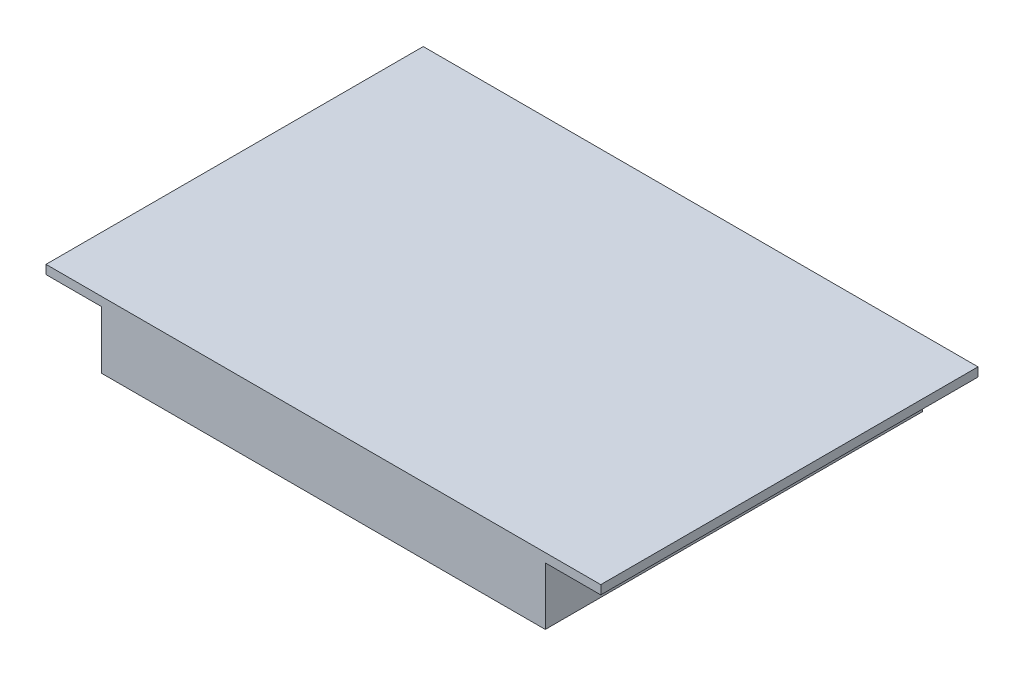
ISO-10303-21;
HEADER;
FILE_DESCRIPTION(('STEP AP214'),'2;1');
FILE_NAME('part.step','',(''),(''),'','','');
FILE_SCHEMA(('AUTOMOTIVE_DESIGN { 1 0 10303 214 1 1 1 1 }'));
ENDSEC;
DATA;
#1=APPLICATION_CONTEXT('core data for automotive mechanical design processes');
#2=APPLICATION_PROTOCOL_DEFINITION('international standard','automotive_design',2000,#1);
#3=PRODUCT_CONTEXT('',#1,'mechanical');
#4=PRODUCT('Part','Part','',(#3));
#5=PRODUCT_RELATED_PRODUCT_CATEGORY('part','',(#4));
#6=PRODUCT_DEFINITION_FORMATION('','',#4);
#7=PRODUCT_DEFINITION_CONTEXT('part definition',#1,'design');
#8=PRODUCT_DEFINITION('design','',#6,#7);
#9=PRODUCT_DEFINITION_SHAPE('','',#8);
#10=(LENGTH_UNIT() NAMED_UNIT(*) SI_UNIT(.MILLI.,.METRE.));
#11=(NAMED_UNIT(*) PLANE_ANGLE_UNIT() SI_UNIT($,.RADIAN.));
#12=(NAMED_UNIT(*) SI_UNIT($,.STERADIAN.) SOLID_ANGLE_UNIT());
#13=UNCERTAINTY_MEASURE_WITH_UNIT(LENGTH_MEASURE(1.E-05),#10,'distance_accuracy_value','');
#14=(GEOMETRIC_REPRESENTATION_CONTEXT(3) GLOBAL_UNCERTAINTY_ASSIGNED_CONTEXT((#13)) GLOBAL_UNIT_ASSIGNED_CONTEXT((#10,
#11,#12)) REPRESENTATION_CONTEXT('',''));
#15=CARTESIAN_POINT('',(0.,0.,0.));
#16=DIRECTION('',(0.,0.,1.));
#17=DIRECTION('',(1.,0.,0.));
#18=AXIS2_PLACEMENT_3D('',#15,#16,#17);
#19=CARTESIAN_POINT('',(0.,-15.,85.));
#20=DIRECTION('',(0.,1.,0.));
#21=DIRECTION('',(0.,0.,1.));
#22=AXIS2_PLACEMENT_3D('',#19,#20,#21);
#23=PLANE('',#22);
#24=DIRECTION('',(1.,0.,0.));
#25=VECTOR('',#24,1.);
#26=CARTESIAN_POINT('',(0.,-15.,-85.));
#27=LINE('',#26,#25);
#28=CARTESIAN_POINT('',(-100.,-15.,-85.));
#29=VERTEX_POINT('',#28);
#30=CARTESIAN_POINT('',(100.,-15.,-85.));
#31=VERTEX_POINT('',#30);
#32=EDGE_CURVE('E132',#29,#31,#27,.T.);
#33=ORIENTED_EDGE('',*,*,#32,.T.);
#34=DIRECTION('',(0.,0.,-1.));
#35=VECTOR('',#34,1.);
#36=CARTESIAN_POINT('',(100.,-15.,85.));
#37=LINE('',#36,#35);
#38=CARTESIAN_POINT('',(100.,-15.,85.));
#39=VERTEX_POINT('',#38);
#40=EDGE_CURVE('E11',#39,#31,#37,.T.);
#41=ORIENTED_EDGE('',*,*,#40,.F.);
#42=DIRECTION('',(1.,0.,0.));
#43=VECTOR('',#42,1.);
#44=CARTESIAN_POINT('',(0.,-15.,85.));
#45=LINE('',#44,#43);
#46=CARTESIAN_POINT('',(-100.,-15.,85.));
#47=VERTEX_POINT('',#46);
#48=EDGE_CURVE('E151',#47,#39,#45,.T.);
#49=ORIENTED_EDGE('',*,*,#48,.F.);
#50=DIRECTION('',(0.,0.,-1.));
#51=VECTOR('',#50,1.);
#52=CARTESIAN_POINT('',(-100.,-15.,85.));
#53=LINE('',#52,#51);
#54=EDGE_CURVE('E51',#47,#29,#53,.T.);
#55=ORIENTED_EDGE('',*,*,#54,.T.);
#56=EDGE_LOOP('',(#33,#41,#49,#55));
#57=FACE_BOUND('',#56,.T.);
#58=ADVANCED_FACE('F35',(#57),#23,.F.);
#59=CARTESIAN_POINT('',(100.,0.,85.));
#60=DIRECTION('',(-1.,0.,0.));
#61=DIRECTION('',(0.,0.,1.));
#62=AXIS2_PLACEMENT_3D('',#59,#60,#61);
#63=PLANE('',#62);
#64=DIRECTION('',(0.,1.,0.));
#65=VECTOR('',#64,1.);
#66=CARTESIAN_POINT('',(100.,0.,-85.));
#67=LINE('',#66,#65);
#68=CARTESIAN_POINT('',(100.,11.,-85.));
#69=VERTEX_POINT('',#68);
#70=EDGE_CURVE('E134',#31,#69,#67,.T.);
#71=ORIENTED_EDGE('',*,*,#70,.T.);
#72=DIRECTION('',(0.,0.,-1.));
#73=VECTOR('',#72,1.);
#74=CARTESIAN_POINT('',(100.,11.,85.));
#75=LINE('',#74,#73);
#76=CARTESIAN_POINT('',(100.,11.,85.));
#77=VERTEX_POINT('',#76);
#78=EDGE_CURVE('E43',#77,#69,#75,.T.);
#79=ORIENTED_EDGE('',*,*,#78,.F.);
#80=DIRECTION('',(0.,1.,0.));
#81=VECTOR('',#80,1.);
#82=CARTESIAN_POINT('',(100.,0.,85.));
#83=LINE('',#82,#81);
#84=EDGE_CURVE('E89',#39,#77,#83,.T.);
#85=ORIENTED_EDGE('',*,*,#84,.F.);
#86=ORIENTED_EDGE('',*,*,#40,.T.);
#87=EDGE_LOOP('',(#71,#79,#85,#86));
#88=FACE_BOUND('',#87,.T.);
#89=ADVANCED_FACE('F178',(#88),#63,.F.);
#90=CARTESIAN_POINT('',(0.,11.,85.));
#91=DIRECTION('',(0.,1.,0.));
#92=DIRECTION('',(-1.,0.,0.));
#93=AXIS2_PLACEMENT_3D('',#90,#91,#92);
#94=PLANE('',#93);
#95=DIRECTION('',(1.,0.,0.));
#96=VECTOR('',#95,1.);
#97=CARTESIAN_POINT('',(0.,11.,-85.));
#98=LINE('',#97,#96);
#99=CARTESIAN_POINT('',(125.,11.,-85.));
#100=VERTEX_POINT('',#99);
#101=EDGE_CURVE('E136',#69,#100,#98,.T.);
#102=ORIENTED_EDGE('',*,*,#101,.T.);
#103=DIRECTION('',(0.,0.,-1.));
#104=VECTOR('',#103,1.);
#105=CARTESIAN_POINT('',(125.,11.,85.));
#106=LINE('',#105,#104);
#107=CARTESIAN_POINT('',(125.,11.,85.));
#108=VERTEX_POINT('',#107);
#109=EDGE_CURVE('E157',#108,#100,#106,.T.);
#110=ORIENTED_EDGE('',*,*,#109,.F.);
#111=DIRECTION('',(1.,0.,0.));
#112=VECTOR('',#111,1.);
#113=CARTESIAN_POINT('',(0.,11.,85.));
#114=LINE('',#113,#112);
#115=EDGE_CURVE('E164',#77,#108,#114,.T.);
#116=ORIENTED_EDGE('',*,*,#115,.F.);
#117=ORIENTED_EDGE('',*,*,#78,.T.);
#118=EDGE_LOOP('',(#102,#110,#116,#117));
#119=FACE_BOUND('',#118,.T.);
#120=ADVANCED_FACE('F162',(#119),#94,.F.);
#121=CARTESIAN_POINT('',(125.,0.,85.));
#122=DIRECTION('',(1.,0.,0.));
#123=DIRECTION('',(0.,0.,-1.));
#124=AXIS2_PLACEMENT_3D('',#121,#122,#123);
#125=PLANE('',#124);
#126=DIRECTION('',(0.,-1.,0.));
#127=VECTOR('',#126,1.);
#128=CARTESIAN_POINT('',(125.,0.,-85.));
#129=LINE('',#128,#127);
#130=CARTESIAN_POINT('',(125.,15.,-85.));
#131=VERTEX_POINT('',#130);
#132=EDGE_CURVE('E139',#131,#100,#129,.T.);
#133=ORIENTED_EDGE('',*,*,#132,.F.);
#134=DIRECTION('',(0.,0.,-1.));
#135=VECTOR('',#134,1.);
#136=CARTESIAN_POINT('',(125.,15.,85.));
#137=LINE('',#136,#135);
#138=CARTESIAN_POINT('',(125.,15.,85.));
#139=VERTEX_POINT('',#138);
#140=EDGE_CURVE('E155',#139,#131,#137,.T.);
#141=ORIENTED_EDGE('',*,*,#140,.F.);
#142=DIRECTION('',(0.,-1.,0.));
#143=VECTOR('',#142,1.);
#144=CARTESIAN_POINT('',(125.,0.,85.));
#145=LINE('',#144,#143);
#146=EDGE_CURVE('E172',#139,#108,#145,.T.);
#147=ORIENTED_EDGE('',*,*,#146,.T.);
#148=ORIENTED_EDGE('',*,*,#109,.T.);
#149=EDGE_LOOP('',(#133,#141,#147,#148));
#150=FACE_BOUND('',#149,.T.);
#151=ADVANCED_FACE('F170',(#150),#125,.T.);
#152=CARTESIAN_POINT('',(0.,15.,85.));
#153=DIRECTION('',(0.,1.,0.));
#154=DIRECTION('',(0.,0.,1.));
#155=AXIS2_PLACEMENT_3D('',#152,#153,#154);
#156=PLANE('',#155);
#157=DIRECTION('',(1.,0.,0.));
#158=VECTOR('',#157,1.);
#159=CARTESIAN_POINT('',(0.,15.,-85.));
#160=LINE('',#159,#158);
#161=CARTESIAN_POINT('',(-125.,15.,-85.));
#162=VERTEX_POINT('',#161);
#163=EDGE_CURVE('E142',#162,#131,#160,.T.);
#164=ORIENTED_EDGE('',*,*,#163,.F.);
#165=DIRECTION('',(0.,0.,-1.));
#166=VECTOR('',#165,1.);
#167=CARTESIAN_POINT('',(-125.,15.,85.));
#168=LINE('',#167,#166);
#169=CARTESIAN_POINT('',(-125.,15.,85.));
#170=VERTEX_POINT('',#169);
#171=EDGE_CURVE('E124',#170,#162,#168,.T.);
#172=ORIENTED_EDGE('',*,*,#171,.F.);
#173=DIRECTION('',(1.,0.,0.));
#174=VECTOR('',#173,1.);
#175=CARTESIAN_POINT('',(0.,15.,85.));
#176=LINE('',#175,#174);
#177=EDGE_CURVE('E114',#170,#139,#176,.T.);
#178=ORIENTED_EDGE('',*,*,#177,.T.);
#179=ORIENTED_EDGE('',*,*,#140,.T.);
#180=EDGE_LOOP('',(#164,#172,#178,#179));
#181=FACE_BOUND('',#180,.T.);
#182=ADVANCED_FACE('F188',(#181),#156,.T.);
#183=CARTESIAN_POINT('',(-125.,0.,85.));
#184=DIRECTION('',(1.,0.,0.));
#185=DIRECTION('',(0.,0.,-1.));
#186=AXIS2_PLACEMENT_3D('',#183,#184,#185);
#187=PLANE('',#186);
#188=DIRECTION('',(0.,-1.,0.));
#189=VECTOR('',#188,1.);
#190=CARTESIAN_POINT('',(-125.,0.,-85.));
#191=LINE('',#190,#189);
#192=CARTESIAN_POINT('',(-125.,11.,-85.));
#193=VERTEX_POINT('',#192);
#194=EDGE_CURVE('E121',#162,#193,#191,.T.);
#195=ORIENTED_EDGE('',*,*,#194,.T.);
#196=DIRECTION('',(0.,0.,-1.));
#197=VECTOR('',#196,1.);
#198=CARTESIAN_POINT('',(-125.,11.,85.));
#199=LINE('',#198,#197);
#200=CARTESIAN_POINT('',(-125.,11.,85.));
#201=VERTEX_POINT('',#200);
#202=EDGE_CURVE('E118',#201,#193,#199,.T.);
#203=ORIENTED_EDGE('',*,*,#202,.F.);
#204=DIRECTION('',(0.,-1.,0.));
#205=VECTOR('',#204,1.);
#206=CARTESIAN_POINT('',(-125.,0.,85.));
#207=LINE('',#206,#205);
#208=EDGE_CURVE('E106',#170,#201,#207,.T.);
#209=ORIENTED_EDGE('',*,*,#208,.F.);
#210=ORIENTED_EDGE('',*,*,#171,.T.);
#211=EDGE_LOOP('',(#195,#203,#209,#210));
#212=FACE_BOUND('',#211,.T.);
#213=ADVANCED_FACE('F119',(#212),#187,.F.);
#214=CARTESIAN_POINT('',(0.,11.,85.));
#215=DIRECTION('',(0.,-1.,0.));
#216=DIRECTION('',(1.,0.,0.));
#217=AXIS2_PLACEMENT_3D('',#214,#215,#216);
#218=PLANE('',#217);
#219=DIRECTION('',(-1.,0.,0.));
#220=VECTOR('',#219,1.);
#221=CARTESIAN_POINT('',(0.,11.,-85.));
#222=LINE('',#221,#220);
#223=CARTESIAN_POINT('',(-100.,11.,-85.));
#224=VERTEX_POINT('',#223);
#225=EDGE_CURVE('E146',#224,#193,#222,.T.);
#226=ORIENTED_EDGE('',*,*,#225,.F.);
#227=DIRECTION('',(0.,0.,-1.));
#228=VECTOR('',#227,1.);
#229=CARTESIAN_POINT('',(-100.,11.,85.));
#230=LINE('',#229,#228);
#231=CARTESIAN_POINT('',(-100.,11.,85.));
#232=VERTEX_POINT('',#231);
#233=EDGE_CURVE('E77',#232,#224,#230,.T.);
#234=ORIENTED_EDGE('',*,*,#233,.F.);
#235=DIRECTION('',(-1.,0.,0.));
#236=VECTOR('',#235,1.);
#237=CARTESIAN_POINT('',(0.,11.,85.));
#238=LINE('',#237,#236);
#239=EDGE_CURVE('E111',#232,#201,#238,.T.);
#240=ORIENTED_EDGE('',*,*,#239,.T.);
#241=ORIENTED_EDGE('',*,*,#202,.T.);
#242=EDGE_LOOP('',(#226,#234,#240,#241));
#243=FACE_BOUND('',#242,.T.);
#244=ADVANCED_FACE('F126',(#243),#218,.T.);
#245=CARTESIAN_POINT('',(-100.,0.,85.));
#246=DIRECTION('',(-1.,0.,0.));
#247=DIRECTION('',(0.,0.,1.));
#248=AXIS2_PLACEMENT_3D('',#245,#246,#247);
#249=PLANE('',#248);
#250=DIRECTION('',(0.,1.,0.));
#251=VECTOR('',#250,1.);
#252=CARTESIAN_POINT('',(-100.,0.,-85.));
#253=LINE('',#252,#251);
#254=EDGE_CURVE('E148',#29,#224,#253,.T.);
#255=ORIENTED_EDGE('',*,*,#254,.F.);
#256=ORIENTED_EDGE('',*,*,#54,.F.);
#257=DIRECTION('',(0.,1.,0.));
#258=VECTOR('',#257,1.);
#259=CARTESIAN_POINT('',(-100.,0.,85.));
#260=LINE('',#259,#258);
#261=EDGE_CURVE('E127',#47,#232,#260,.T.);
#262=ORIENTED_EDGE('',*,*,#261,.T.);
#263=ORIENTED_EDGE('',*,*,#233,.T.);
#264=EDGE_LOOP('',(#255,#256,#262,#263));
#265=FACE_BOUND('',#264,.T.);
#266=ADVANCED_FACE('F196',(#265),#249,.T.);
#267=CARTESIAN_POINT('',(0.,0.,85.));
#268=DIRECTION('',(0.,0.,1.));
#269=DIRECTION('',(1.,0.,0.));
#270=AXIS2_PLACEMENT_3D('',#267,#268,#269);
#271=PLANE('',#270);
#272=ORIENTED_EDGE('',*,*,#48,.T.);
#273=ORIENTED_EDGE('',*,*,#84,.T.);
#274=ORIENTED_EDGE('',*,*,#115,.T.);
#275=ORIENTED_EDGE('',*,*,#146,.F.);
#276=ORIENTED_EDGE('',*,*,#177,.F.);
#277=ORIENTED_EDGE('',*,*,#208,.T.);
#278=ORIENTED_EDGE('',*,*,#239,.F.);
#279=ORIENTED_EDGE('',*,*,#261,.F.);
#280=EDGE_LOOP('',(#272,#273,#274,#275,#276,#277,#278,#279));
#281=FACE_BOUND('',#280,.T.);
#282=ADVANCED_FACE('F108',(#281),#271,.T.);
#283=CARTESIAN_POINT('',(0.,0.,-85.));
#284=DIRECTION('',(0.,0.,1.));
#285=DIRECTION('',(1.,0.,0.));
#286=AXIS2_PLACEMENT_3D('',#283,#284,#285);
#287=PLANE('',#286);
#288=ORIENTED_EDGE('',*,*,#32,.F.);
#289=ORIENTED_EDGE('',*,*,#254,.T.);
#290=ORIENTED_EDGE('',*,*,#225,.T.);
#291=ORIENTED_EDGE('',*,*,#194,.F.);
#292=ORIENTED_EDGE('',*,*,#163,.T.);
#293=ORIENTED_EDGE('',*,*,#132,.T.);
#294=ORIENTED_EDGE('',*,*,#101,.F.);
#295=ORIENTED_EDGE('',*,*,#70,.F.);
#296=EDGE_LOOP('',(#288,#289,#290,#291,#292,#293,#294,#295));
#297=FACE_BOUND('',#296,.T.);
#298=ADVANCED_FACE('F166',(#297),#287,.F.);
#299=CLOSED_SHELL('',(#58,#89,#120,#151,#182,#213,#244,#266,#282,#298));
#300=MANIFOLD_SOLID_BREP('B2',#299);
#301=ADVANCED_BREP_SHAPE_REPRESENTATION('',(#18,#300),#14);
#302=SHAPE_DEFINITION_REPRESENTATION(#9,#301);
ENDSEC;
END-ISO-10303-21;
